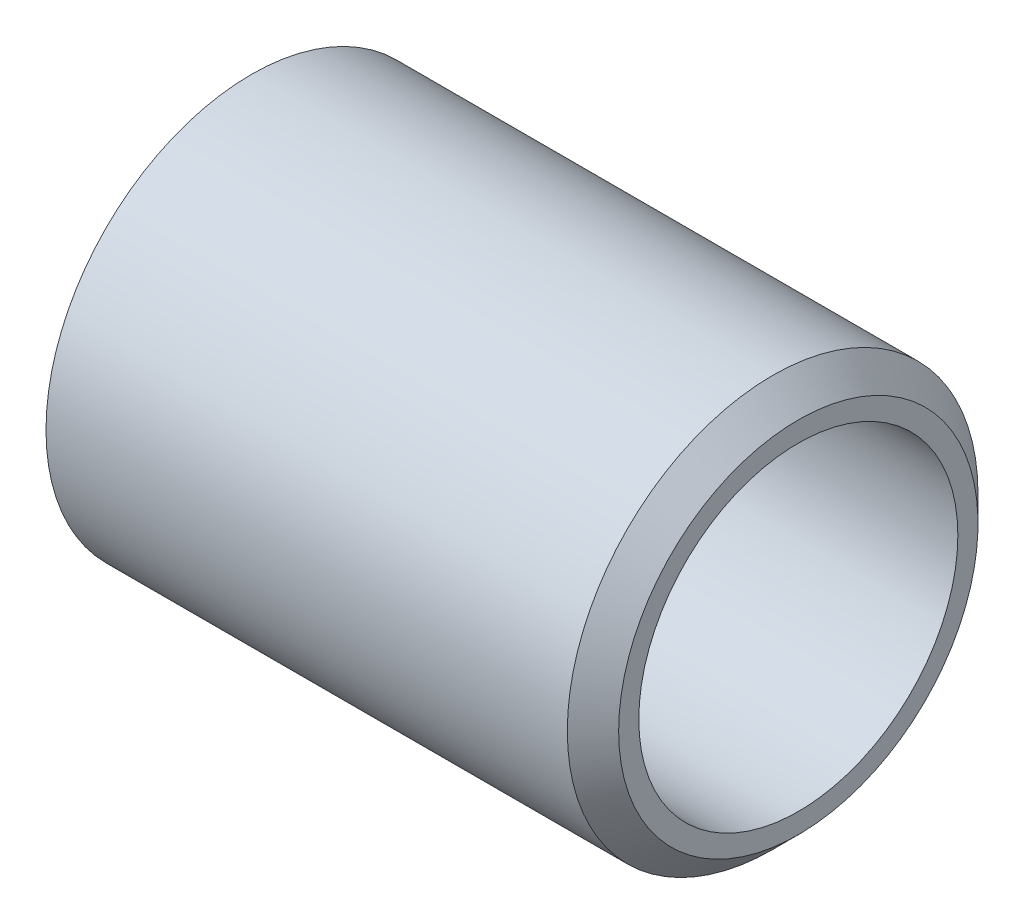
ISO-10303-21;
HEADER;
FILE_DESCRIPTION(('STEP AP214'),'2;1');
FILE_NAME('part.step','',(''),(''),'','','');
FILE_SCHEMA(('AUTOMOTIVE_DESIGN { 1 0 10303 214 1 1 1 1 }'));
ENDSEC;
DATA;
#1=APPLICATION_CONTEXT('core data for automotive mechanical design processes');
#2=APPLICATION_PROTOCOL_DEFINITION('international standard','automotive_design',2000,#1);
#3=PRODUCT_CONTEXT('',#1,'mechanical');
#4=PRODUCT('Part','Part','',(#3));
#5=PRODUCT_RELATED_PRODUCT_CATEGORY('part','',(#4));
#6=PRODUCT_DEFINITION_FORMATION('','',#4);
#7=PRODUCT_DEFINITION_CONTEXT('part definition',#1,'design');
#8=PRODUCT_DEFINITION('design','',#6,#7);
#9=PRODUCT_DEFINITION_SHAPE('','',#8);
#10=(LENGTH_UNIT() NAMED_UNIT(*) SI_UNIT(.MILLI.,.METRE.));
#11=(NAMED_UNIT(*) PLANE_ANGLE_UNIT() SI_UNIT($,.RADIAN.));
#12=(NAMED_UNIT(*) SI_UNIT($,.STERADIAN.) SOLID_ANGLE_UNIT());
#13=UNCERTAINTY_MEASURE_WITH_UNIT(LENGTH_MEASURE(1.E-05),#10,'distance_accuracy_value','');
#14=(GEOMETRIC_REPRESENTATION_CONTEXT(3) GLOBAL_UNCERTAINTY_ASSIGNED_CONTEXT((#13)) GLOBAL_UNIT_ASSIGNED_CONTEXT((#10,
#11,#12)) REPRESENTATION_CONTEXT('',''));
#15=CARTESIAN_POINT('',(0.,0.,0.));
#16=DIRECTION('',(0.,0.,1.));
#17=DIRECTION('',(1.,0.,0.));
#18=AXIS2_PLACEMENT_3D('',#15,#16,#17);
#19=CARTESIAN_POINT('',(0.,0.,0.));
#20=DIRECTION('',(-1.,0.,0.));
#21=DIRECTION('',(0.,0.,1.));
#22=AXIS2_PLACEMENT_3D('',#19,#20,#21);
#23=CYLINDRICAL_SURFACE('',#22,28.60675);
#24=CARTESIAN_POINT('',(72.62415625,0.,0.));
#25=DIRECTION('',(-1.,0.,0.));
#26=DIRECTION('',(0.,0.,1.));
#27=AXIS2_PLACEMENT_3D('',#24,#25,#26);
#28=CIRCLE('',#27,28.60675);
#29=CARTESIAN_POINT('',(72.62415625,0.,28.60675));
#30=VERTEX_POINT('',#29);
#31=EDGE_CURVE('E52',#30,#30,#28,.T.);
#32=ORIENTED_EDGE('',*,*,#31,.T.);
#33=EDGE_LOOP('',(#32));
#34=FACE_BOUND('',#33,.T.);
#35=CARTESIAN_POINT('',(0.,0.,0.));
#36=DIRECTION('',(-1.,0.,0.));
#37=DIRECTION('',(0.,0.,1.));
#38=AXIS2_PLACEMENT_3D('',#35,#36,#37);
#39=CIRCLE('',#38,28.60675);
#40=CARTESIAN_POINT('',(0.,0.,28.60675));
#41=VERTEX_POINT('',#40);
#42=EDGE_CURVE('E10',#41,#41,#39,.T.);
#43=ORIENTED_EDGE('',*,*,#42,.F.);
#44=EDGE_LOOP('',(#43));
#45=FACE_BOUND('',#44,.T.);
#46=ADVANCED_FACE('F30',(#34,#45),#23,.T.);
#47=CARTESIAN_POINT('',(0.,24.6126,0.));
#48=DIRECTION('',(-1.,0.,0.));
#49=DIRECTION('',(0.,0.,1.));
#50=AXIS2_PLACEMENT_3D('',#47,#48,#49);
#51=PLANE('',#50);
#52=ORIENTED_EDGE('',*,*,#42,.T.);
#53=EDGE_LOOP('',(#52));
#54=FACE_BOUND('',#53,.T.);
#55=CARTESIAN_POINT('',(0.,0.,0.));
#56=DIRECTION('',(-1.,0.,0.));
#57=DIRECTION('',(0.,0.,1.));
#58=AXIS2_PLACEMENT_3D('',#55,#56,#57);
#59=CIRCLE('',#58,24.6126);
#60=CARTESIAN_POINT('',(0.,0.,24.6126));
#61=VERTEX_POINT('',#60);
#62=EDGE_CURVE('E36',#61,#61,#59,.T.);
#63=ORIENTED_EDGE('',*,*,#62,.F.);
#64=EDGE_LOOP('',(#63));
#65=FACE_BOUND('',#64,.T.);
#66=ADVANCED_FACE('F70',(#54,#65),#51,.T.);
#67=CARTESIAN_POINT('',(2.3876,0.,0.));
#68=DIRECTION('',(-1.,0.,0.));
#69=DIRECTION('',(0.,0.,1.));
#70=AXIS2_PLACEMENT_3D('',#67,#68,#69);
#71=TOROIDAL_SURFACE('',#70,24.6126,2.3876);
#72=CARTESIAN_POINT('',(2.3876,0.,0.));
#73=DIRECTION('',(-1.,0.,0.));
#74=DIRECTION('',(0.,0.,1.));
#75=AXIS2_PLACEMENT_3D('',#72,#73,#74);
#76=CIRCLE('',#75,22.225);
#77=CARTESIAN_POINT('',(2.3876,0.,22.225));
#78=VERTEX_POINT('',#77);
#79=EDGE_CURVE('E40',#78,#78,#76,.T.);
#80=ORIENTED_EDGE('',*,*,#79,.F.);
#81=EDGE_LOOP('',(#80));
#82=FACE_BOUND('',#81,.T.);
#83=ORIENTED_EDGE('',*,*,#62,.T.);
#84=EDGE_LOOP('',(#83));
#85=FACE_BOUND('',#84,.T.);
#86=ADVANCED_FACE('F74',(#82,#85),#71,.T.);
#87=CARTESIAN_POINT('',(0.,0.,0.));
#88=DIRECTION('',(-1.,0.,0.));
#89=DIRECTION('',(0.,0.,1.));
#90=AXIS2_PLACEMENT_3D('',#87,#88,#89);
#91=CYLINDRICAL_SURFACE('',#90,22.225);
#92=ORIENTED_EDGE('',*,*,#79,.T.);
#93=EDGE_LOOP('',(#92));
#94=FACE_BOUND('',#93,.T.);
#95=CARTESIAN_POINT('',(76.2,0.,0.));
#96=DIRECTION('',(-1.,0.,0.));
#97=DIRECTION('',(0.,0.,1.));
#98=AXIS2_PLACEMENT_3D('',#95,#96,#97);
#99=CIRCLE('',#98,22.225);
#100=CARTESIAN_POINT('',(76.2,0.,22.225));
#101=VERTEX_POINT('',#100);
#102=EDGE_CURVE('E44',#101,#101,#99,.T.);
#103=ORIENTED_EDGE('',*,*,#102,.F.);
#104=EDGE_LOOP('',(#103));
#105=FACE_BOUND('',#104,.T.);
#106=ADVANCED_FACE('F66',(#94,#105),#91,.F.);
#107=CARTESIAN_POINT('',(76.2,25.03090625,0.));
#108=DIRECTION('',(1.,0.,0.));
#109=DIRECTION('',(0.,0.,-1.));
#110=AXIS2_PLACEMENT_3D('',#107,#108,#109);
#111=PLANE('',#110);
#112=ORIENTED_EDGE('',*,*,#102,.T.);
#113=EDGE_LOOP('',(#112));
#114=FACE_BOUND('',#113,.T.);
#115=CARTESIAN_POINT('',(76.2,0.,0.));
#116=DIRECTION('',(-1.,0.,0.));
#117=DIRECTION('',(0.,0.,1.));
#118=AXIS2_PLACEMENT_3D('',#115,#116,#117);
#119=CIRCLE('',#118,25.03090625);
#120=CARTESIAN_POINT('',(76.2,0.,25.03090625));
#121=VERTEX_POINT('',#120);
#122=EDGE_CURVE('E49',#121,#121,#119,.T.);
#123=ORIENTED_EDGE('',*,*,#122,.F.);
#124=EDGE_LOOP('',(#123));
#125=FACE_BOUND('',#124,.T.);
#126=ADVANCED_FACE('F60',(#114,#125),#111,.T.);
#127=CARTESIAN_POINT('',(72.62415625,0.,0.));
#128=DIRECTION('',(-1.,0.,0.));
#129=DIRECTION('',(0.,0.,1.));
#130=AXIS2_PLACEMENT_3D('',#127,#128,#129);
#131=CONICAL_SURFACE('',#130,28.60675,0.785398163397445);
#132=ORIENTED_EDGE('',*,*,#122,.T.);
#133=EDGE_LOOP('',(#132));
#134=FACE_BOUND('',#133,.T.);
#135=ORIENTED_EDGE('',*,*,#31,.F.);
#136=EDGE_LOOP('',(#135));
#137=FACE_BOUND('',#136,.T.);
#138=ADVANCED_FACE('F58',(#134,#137),#131,.T.);
#139=CLOSED_SHELL('',(#46,#66,#86,#106,#126,#138));
#140=MANIFOLD_SOLID_BREP('B2',#139);
#141=ADVANCED_BREP_SHAPE_REPRESENTATION('',(#18,#140),#14);
#142=SHAPE_DEFINITION_REPRESENTATION(#9,#141);
ENDSEC;
END-ISO-10303-21;
